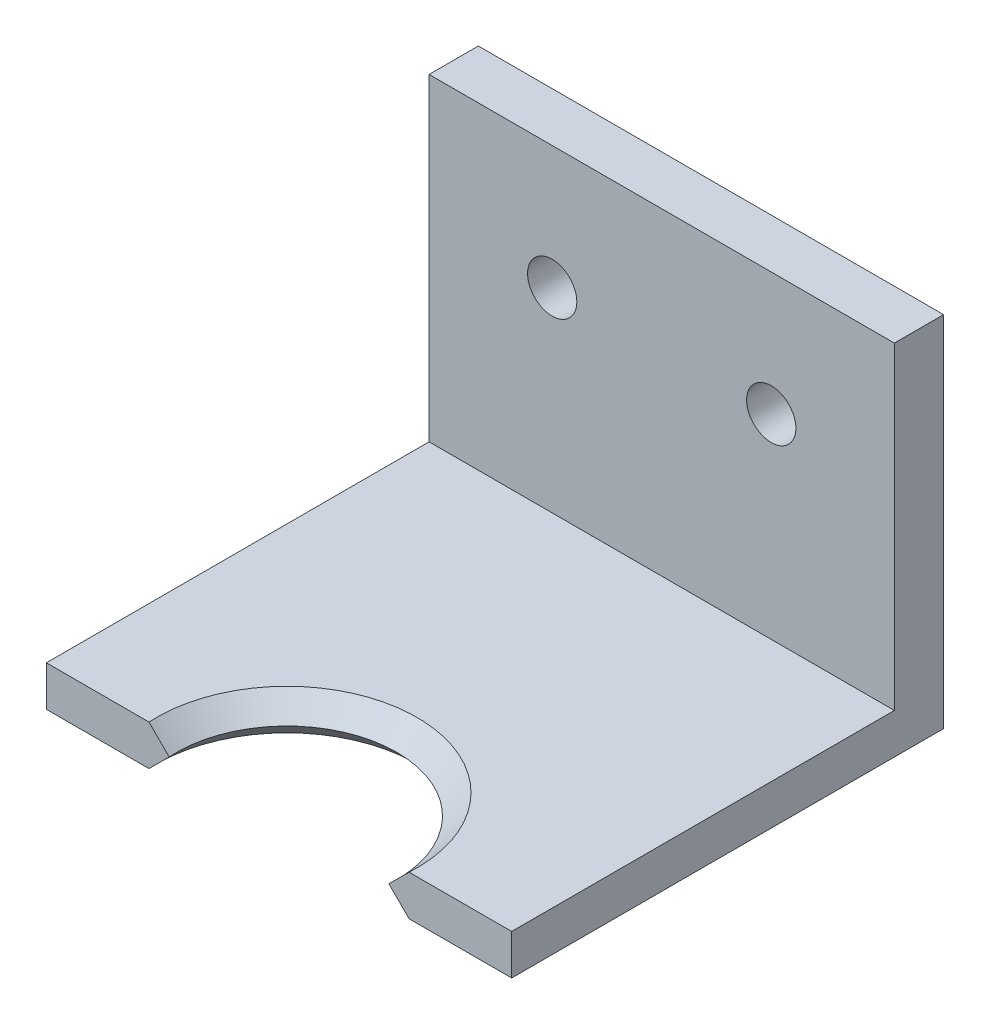
ISO-10303-21;
HEADER;
FILE_DESCRIPTION(('STEP AP214'),'2;1');
FILE_NAME('part.step','',(''),(''),'','','');
FILE_SCHEMA(('AUTOMOTIVE_DESIGN { 1 0 10303 214 1 1 1 1 }'));
ENDSEC;
DATA;
#1=APPLICATION_CONTEXT('core data for automotive mechanical design processes');
#2=APPLICATION_PROTOCOL_DEFINITION('international standard','automotive_design',2000,#1);
#3=PRODUCT_CONTEXT('',#1,'mechanical');
#4=PRODUCT('Part','Part','',(#3));
#5=PRODUCT_RELATED_PRODUCT_CATEGORY('part','',(#4));
#6=PRODUCT_DEFINITION_FORMATION('','',#4);
#7=PRODUCT_DEFINITION_CONTEXT('part definition',#1,'design');
#8=PRODUCT_DEFINITION('design','',#6,#7);
#9=PRODUCT_DEFINITION_SHAPE('','',#8);
#10=(LENGTH_UNIT() NAMED_UNIT(*) SI_UNIT(.MILLI.,.METRE.));
#11=(NAMED_UNIT(*) PLANE_ANGLE_UNIT() SI_UNIT($,.RADIAN.));
#12=(NAMED_UNIT(*) SI_UNIT($,.STERADIAN.) SOLID_ANGLE_UNIT());
#13=UNCERTAINTY_MEASURE_WITH_UNIT(LENGTH_MEASURE(1.E-05),#10,'distance_accuracy_value','');
#14=(GEOMETRIC_REPRESENTATION_CONTEXT(3) GLOBAL_UNCERTAINTY_ASSIGNED_CONTEXT((#13)) GLOBAL_UNIT_ASSIGNED_CONTEXT((#10,
#11,#12)) REPRESENTATION_CONTEXT('',''));
#15=CARTESIAN_POINT('',(0.,0.,0.));
#16=DIRECTION('',(0.,0.,1.));
#17=DIRECTION('',(1.,0.,0.));
#18=AXIS2_PLACEMENT_3D('',#15,#16,#17);
#19=CARTESIAN_POINT('',(30.,-2.6,0.));
#20=DIRECTION('',(0.,0.,-1.));
#21=DIRECTION('',(-1.,0.,0.));
#22=AXIS2_PLACEMENT_3D('',#19,#20,#21);
#23=PLANE('',#22);
#24=DIRECTION('',(-1.,0.,0.));
#25=VECTOR('',#24,1.);
#26=CARTESIAN_POINT('',(30.,-2.6,0.));
#27=LINE('',#26,#25);
#28=CARTESIAN_POINT('',(6.61489415689939,-2.6,0.));
#29=VERTEX_POINT('',#28);
#30=CARTESIAN_POINT('',(0.,-2.6,0.));
#31=VERTEX_POINT('',#30);
#32=EDGE_CURVE('E135',#29,#31,#27,.T.);
#33=ORIENTED_EDGE('',*,*,#32,.F.);
#34=CARTESIAN_POINT('',(6.61489415689939,-2.6,0.));
#35=CARTESIAN_POINT('',(6.83197813496742,-2.38329500472277,0.));
#36=CARTESIAN_POINT('',(7.04908123720135,-2.16660917382159,0.));
#37=CARTESIAN_POINT('',(7.48332569028473,-1.73327584048821,0.));
#38=CARTESIAN_POINT('',(7.70046704113424,-1.51662833805605,0.));
#39=CARTESIAN_POINT('',(7.91762751614969,-1.3,0.));
#40=B_SPLINE_CURVE_WITH_KNOTS('',3,(#34,#35,#36,#37,#38,#39),.UNSPECIFIED.,.F.,.F.,(4,2,4),(0.,
0.920205714401046,1.84041143000467),.UNSPECIFIED.);
#41=CARTESIAN_POINT('',(7.91762751614969,-1.30000000000001,0.));
#42=VERTEX_POINT('',#41);
#43=EDGE_CURVE('E148',#29,#42,#40,.T.);
#44=ORIENTED_EDGE('',*,*,#43,.T.);
#45=CARTESIAN_POINT('',(7.91762751614969,-1.30000000000001,0.));
#46=CARTESIAN_POINT('',(7.70046704113424,-1.08337166194395,0.));
#47=CARTESIAN_POINT('',(7.48332569028473,-0.866724159511791,0.));
#48=CARTESIAN_POINT('',(7.04908123720134,-0.433390826178405,0.));
#49=CARTESIAN_POINT('',(6.83197813496741,-0.216704995277231,0.));
#50=CARTESIAN_POINT('',(6.61489415689938,0.,0.));
#51=B_SPLINE_CURVE_WITH_KNOTS('',3,(#45,#46,#47,#48,#49,#50),.UNSPECIFIED.,.F.,.F.,(4,2,4),(0.,
0.92020571560363,1.84041143000468),.UNSPECIFIED.);
#52=CARTESIAN_POINT('',(6.61489415689938,0.,0.));
#53=VERTEX_POINT('',#52);
#54=EDGE_CURVE('E137',#42,#53,#51,.T.);
#55=ORIENTED_EDGE('',*,*,#54,.T.);
#56=DIRECTION('',(-1.,0.,0.));
#57=VECTOR('',#56,1.);
#58=CARTESIAN_POINT('',(30.,0.,0.));
#59=LINE('',#58,#57);
#60=CARTESIAN_POINT('',(0.,0.,0.));
#61=VERTEX_POINT('',#60);
#62=EDGE_CURVE('E203',#53,#61,#59,.T.);
#63=ORIENTED_EDGE('',*,*,#62,.T.);
#64=DIRECTION('',(0.,-1.,0.));
#65=VECTOR('',#64,1.);
#66=CARTESIAN_POINT('',(0.,-2.6,0.));
#67=LINE('',#66,#65);
#68=EDGE_CURVE('E180',#61,#31,#67,.T.);
#69=ORIENTED_EDGE('',*,*,#68,.T.);
#70=EDGE_LOOP('',(#33,#44,#55,#63,#69));
#71=FACE_BOUND('',#70,.T.);
#72=ADVANCED_FACE('F38',(#71),#23,.F.);
#73=CARTESIAN_POINT('',(23.3851058431006,0.,0.));
#74=CARTESIAN_POINT('',(23.1680218650326,-0.216704995277232,0.));
#75=CARTESIAN_POINT('',(22.9509187627987,-0.433390826178406,0.));
#76=CARTESIAN_POINT('',(22.5166743097153,-0.866724159511792,0.));
#77=CARTESIAN_POINT('',(22.2995329588658,-1.08337166194395,0.));
#78=CARTESIAN_POINT('',(22.0823724838503,-1.30000000000001,0.));
#79=B_SPLINE_CURVE_WITH_KNOTS('',3,(#73,#74,#75,#76,#77,#78),.UNSPECIFIED.,.F.,.F.,(4,2,4),(0.,
0.920205714401049,1.84041143000468),.UNSPECIFIED.);
#80=CARTESIAN_POINT('',(23.3851058431006,0.,0.));
#81=VERTEX_POINT('',#80);
#82=CARTESIAN_POINT('',(22.0823724838503,-1.30000000000001,0.));
#83=VERTEX_POINT('',#82);
#84=EDGE_CURVE('E56',#81,#83,#79,.T.);
#85=ORIENTED_EDGE('',*,*,#84,.T.);
#86=CARTESIAN_POINT('',(22.0823724838503,-1.29999999999999,0.));
#87=CARTESIAN_POINT('',(22.2995329588658,-1.51662833805605,0.));
#88=CARTESIAN_POINT('',(22.5166743097153,-1.73327584048821,0.));
#89=CARTESIAN_POINT('',(22.9509187627987,-2.16660917382159,0.));
#90=CARTESIAN_POINT('',(23.1680218650326,-2.38329500472277,0.));
#91=CARTESIAN_POINT('',(23.3851058431006,-2.6,0.));
#92=B_SPLINE_CURVE_WITH_KNOTS('',3,(#86,#87,#88,#89,#90,#91),.UNSPECIFIED.,.F.,.F.,(4,2,4),(0.,
0.920205715603628,1.84041143000467),.UNSPECIFIED.);
#93=CARTESIAN_POINT('',(23.3851058431006,-2.6,0.));
#94=VERTEX_POINT('',#93);
#95=EDGE_CURVE('E49',#83,#94,#92,.T.);
#96=ORIENTED_EDGE('',*,*,#95,.T.);
#97=CARTESIAN_POINT('',(30.,-2.6,0.));
#98=VERTEX_POINT('',#97);
#99=EDGE_CURVE('E117',#98,#94,#27,.T.);
#100=ORIENTED_EDGE('',*,*,#99,.F.);
#101=DIRECTION('',(0.,-1.,0.));
#102=VECTOR('',#101,1.);
#103=CARTESIAN_POINT('',(30.,-2.6,0.));
#104=LINE('',#103,#102);
#105=CARTESIAN_POINT('',(30.,0.,0.));
#106=VERTEX_POINT('',#105);
#107=EDGE_CURVE('E124',#106,#98,#104,.T.);
#108=ORIENTED_EDGE('',*,*,#107,.F.);
#109=EDGE_CURVE('E214',#106,#81,#59,.T.);
#110=ORIENTED_EDGE('',*,*,#109,.T.);
#111=EDGE_LOOP('',(#85,#96,#100,#108,#110));
#112=FACE_BOUND('',#111,.T.);
#113=ADVANCED_FACE('F132',(#112),#23,.F.);
#114=CARTESIAN_POINT('',(30.,-2.6,-27.85));
#115=DIRECTION('',(0.,1.,0.));
#116=DIRECTION('',(0.,0.,1.));
#117=AXIS2_PLACEMENT_3D('',#114,#115,#116);
#118=PLANE('',#117);
#119=ORIENTED_EDGE('',*,*,#99,.T.);
#120=CARTESIAN_POINT('',(15.,-2.6,-0.5));
#121=DIRECTION('',(0.,1.,0.));
#122=DIRECTION('',(0.,0.,1.));
#123=AXIS2_PLACEMENT_3D('',#120,#121,#122);
#124=CIRCLE('',#123,8.4);
#125=EDGE_CURVE('E134',#94,#29,#124,.T.);
#126=ORIENTED_EDGE('',*,*,#125,.T.);
#127=ORIENTED_EDGE('',*,*,#32,.T.);
#128=DIRECTION('',(0.,0.,-1.));
#129=VECTOR('',#128,1.);
#130=CARTESIAN_POINT('',(0.,-2.6,-27.85));
#131=LINE('',#130,#129);
#132=CARTESIAN_POINT('',(0.,-2.6,-27.85));
#133=VERTEX_POINT('',#132);
#134=EDGE_CURVE('E182',#31,#133,#131,.T.);
#135=ORIENTED_EDGE('',*,*,#134,.T.);
#136=DIRECTION('',(-1.,0.,0.));
#137=VECTOR('',#136,1.);
#138=CARTESIAN_POINT('',(30.,-2.6,-27.85));
#139=LINE('',#138,#137);
#140=CARTESIAN_POINT('',(30.,-2.6,-27.85));
#141=VERTEX_POINT('',#140);
#142=EDGE_CURVE('E120',#141,#133,#139,.T.);
#143=ORIENTED_EDGE('',*,*,#142,.F.);
#144=DIRECTION('',(0.,0.,-1.));
#145=VECTOR('',#144,1.);
#146=CARTESIAN_POINT('',(30.,-2.6,-27.85));
#147=LINE('',#146,#145);
#148=EDGE_CURVE('E112',#98,#141,#147,.T.);
#149=ORIENTED_EDGE('',*,*,#148,.F.);
#150=EDGE_LOOP('',(#119,#126,#127,#135,#143,#149));
#151=FACE_BOUND('',#150,.T.);
#152=ADVANCED_FACE('F114',(#151),#118,.F.);
#153=CARTESIAN_POINT('',(30.,20.5151439999999,-27.85));
#154=DIRECTION('',(0.,0.,1.));
#155=DIRECTION('',(0.,-1.,0.));
#156=AXIS2_PLACEMENT_3D('',#153,#154,#155);
#157=PLANE('',#156);
#158=CARTESIAN_POINT('',(7.9375,12.5776439999999,-27.85));
#159=DIRECTION('',(0.,0.,1.));
#160=DIRECTION('',(1.,0.,0.));
#161=AXIS2_PLACEMENT_3D('',#158,#159,#160);
#162=CIRCLE('',#161,1.5875);
#163=CARTESIAN_POINT('',(9.525,12.5776439999999,-27.85));
#164=VERTEX_POINT('',#163);
#165=EDGE_CURVE('E181',#164,#164,#162,.T.);
#166=ORIENTED_EDGE('',*,*,#165,.T.);
#167=EDGE_LOOP('',(#166));
#168=FACE_BOUND('',#167,.T.);
#169=CARTESIAN_POINT('',(22.0625,12.5776439999999,-27.85));
#170=DIRECTION('',(0.,0.,1.));
#171=DIRECTION('',(1.,0.,0.));
#172=AXIS2_PLACEMENT_3D('',#169,#170,#171);
#173=CIRCLE('',#172,1.5875);
#174=CARTESIAN_POINT('',(23.65,12.5776439999999,-27.85));
#175=VERTEX_POINT('',#174);
#176=EDGE_CURVE('E195',#175,#175,#173,.T.);
#177=ORIENTED_EDGE('',*,*,#176,.T.);
#178=EDGE_LOOP('',(#177));
#179=FACE_BOUND('',#178,.T.);
#180=DIRECTION('',(0.,1.,0.));
#181=VECTOR('',#180,1.);
#182=CARTESIAN_POINT('',(0.,20.5151439999999,-27.85));
#183=LINE('',#182,#181);
#184=CARTESIAN_POINT('',(0.,20.5151439999999,-27.85));
#185=VERTEX_POINT('',#184);
#186=EDGE_CURVE('E206',#133,#185,#183,.T.);
#187=ORIENTED_EDGE('',*,*,#186,.T.);
#188=DIRECTION('',(-1.,0.,0.));
#189=VECTOR('',#188,1.);
#190=CARTESIAN_POINT('',(30.,20.5151439999999,-27.85));
#191=LINE('',#190,#189);
#192=CARTESIAN_POINT('',(30.,20.5151439999999,-27.85));
#193=VERTEX_POINT('',#192);
#194=EDGE_CURVE('E221',#193,#185,#191,.T.);
#195=ORIENTED_EDGE('',*,*,#194,.F.);
#196=DIRECTION('',(0.,1.,0.));
#197=VECTOR('',#196,1.);
#198=CARTESIAN_POINT('',(30.,20.5151439999999,-27.85));
#199=LINE('',#198,#197);
#200=EDGE_CURVE('E123',#141,#193,#199,.T.);
#201=ORIENTED_EDGE('',*,*,#200,.F.);
#202=ORIENTED_EDGE('',*,*,#142,.T.);
#203=EDGE_LOOP('',(#187,#195,#201,#202));
#204=FACE_BOUND('',#203,.T.);
#205=ADVANCED_FACE('F229',(#168,#179,#204),#157,.F.);
#206=CARTESIAN_POINT('',(30.,20.5151439999999,-24.675));
#207=DIRECTION('',(0.,-1.,0.));
#208=DIRECTION('',(0.,0.,-1.));
#209=AXIS2_PLACEMENT_3D('',#206,#207,#208);
#210=PLANE('',#209);
#211=DIRECTION('',(0.,0.,1.));
#212=VECTOR('',#211,1.);
#213=CARTESIAN_POINT('',(0.,20.5151439999999,-24.675));
#214=LINE('',#213,#212);
#215=CARTESIAN_POINT('',(0.,20.5151439999999,-24.675));
#216=VERTEX_POINT('',#215);
#217=EDGE_CURVE('E208',#185,#216,#214,.T.);
#218=ORIENTED_EDGE('',*,*,#217,.T.);
#219=DIRECTION('',(-1.,0.,0.));
#220=VECTOR('',#219,1.);
#221=CARTESIAN_POINT('',(30.,20.5151439999999,-24.675));
#222=LINE('',#221,#220);
#223=CARTESIAN_POINT('',(30.,20.5151439999999,-24.675));
#224=VERTEX_POINT('',#223);
#225=EDGE_CURVE('E219',#224,#216,#222,.T.);
#226=ORIENTED_EDGE('',*,*,#225,.F.);
#227=DIRECTION('',(0.,0.,1.));
#228=VECTOR('',#227,1.);
#229=CARTESIAN_POINT('',(30.,20.5151439999999,-24.675));
#230=LINE('',#229,#228);
#231=EDGE_CURVE('E199',#193,#224,#230,.T.);
#232=ORIENTED_EDGE('',*,*,#231,.F.);
#233=ORIENTED_EDGE('',*,*,#194,.T.);
#234=EDGE_LOOP('',(#218,#226,#232,#233));
#235=FACE_BOUND('',#234,.T.);
#236=ADVANCED_FACE('F237',(#235),#210,.F.);
#237=CARTESIAN_POINT('',(30.,0.,-24.675));
#238=DIRECTION('',(0.,0.,-1.));
#239=DIRECTION('',(0.,1.,0.));
#240=AXIS2_PLACEMENT_3D('',#237,#238,#239);
#241=PLANE('',#240);
#242=CARTESIAN_POINT('',(7.9375,12.5776439999999,-24.675));
#243=DIRECTION('',(0.,0.,1.));
#244=DIRECTION('',(1.,0.,0.));
#245=AXIS2_PLACEMENT_3D('',#242,#243,#244);
#246=CIRCLE('',#245,1.5875);
#247=CARTESIAN_POINT('',(9.525,12.5776439999999,-24.675));
#248=VERTEX_POINT('',#247);
#249=EDGE_CURVE('E185',#248,#248,#246,.T.);
#250=ORIENTED_EDGE('',*,*,#249,.F.);
#251=EDGE_LOOP('',(#250));
#252=FACE_BOUND('',#251,.T.);
#253=CARTESIAN_POINT('',(22.0625,12.5776439999999,-24.675));
#254=DIRECTION('',(0.,0.,1.));
#255=DIRECTION('',(1.,0.,0.));
#256=AXIS2_PLACEMENT_3D('',#253,#254,#255);
#257=CIRCLE('',#256,1.5875);
#258=CARTESIAN_POINT('',(23.65,12.5776439999999,-24.675));
#259=VERTEX_POINT('',#258);
#260=EDGE_CURVE('E190',#259,#259,#257,.T.);
#261=ORIENTED_EDGE('',*,*,#260,.F.);
#262=EDGE_LOOP('',(#261));
#263=FACE_BOUND('',#262,.T.);
#264=DIRECTION('',(0.,-1.,0.));
#265=VECTOR('',#264,1.);
#266=CARTESIAN_POINT('',(0.,0.,-24.675));
#267=LINE('',#266,#265);
#268=CARTESIAN_POINT('',(0.,0.,-24.675));
#269=VERTEX_POINT('',#268);
#270=EDGE_CURVE('E210',#216,#269,#267,.T.);
#271=ORIENTED_EDGE('',*,*,#270,.T.);
#272=DIRECTION('',(-1.,0.,0.));
#273=VECTOR('',#272,1.);
#274=CARTESIAN_POINT('',(30.,0.,-24.675));
#275=LINE('',#274,#273);
#276=CARTESIAN_POINT('',(30.,0.,-24.675));
#277=VERTEX_POINT('',#276);
#278=EDGE_CURVE('E216',#277,#269,#275,.T.);
#279=ORIENTED_EDGE('',*,*,#278,.F.);
#280=DIRECTION('',(0.,-1.,0.));
#281=VECTOR('',#280,1.);
#282=CARTESIAN_POINT('',(30.,0.,-24.675));
#283=LINE('',#282,#281);
#284=EDGE_CURVE('E201',#224,#277,#283,.T.);
#285=ORIENTED_EDGE('',*,*,#284,.F.);
#286=ORIENTED_EDGE('',*,*,#225,.T.);
#287=EDGE_LOOP('',(#271,#279,#285,#286));
#288=FACE_BOUND('',#287,.T.);
#289=ADVANCED_FACE('F240',(#252,#263,#288),#241,.F.);
#290=CARTESIAN_POINT('',(30.,0.,0.));
#291=DIRECTION('',(0.,-1.,0.));
#292=DIRECTION('',(0.,0.,-1.));
#293=AXIS2_PLACEMENT_3D('',#290,#291,#292);
#294=PLANE('',#293);
#295=ORIENTED_EDGE('',*,*,#62,.F.);
#296=CARTESIAN_POINT('',(15.,0.,-0.5));
#297=DIRECTION('',(0.,-1.,0.));
#298=DIRECTION('',(0.,0.,-1.));
#299=AXIS2_PLACEMENT_3D('',#296,#297,#298);
#300=CIRCLE('',#299,8.40000000000001);
#301=EDGE_CURVE('E11',#53,#81,#300,.T.);
#302=ORIENTED_EDGE('',*,*,#301,.T.);
#303=ORIENTED_EDGE('',*,*,#109,.F.);
#304=DIRECTION('',(0.,0.,1.));
#305=VECTOR('',#304,1.);
#306=CARTESIAN_POINT('',(30.,0.,0.));
#307=LINE('',#306,#305);
#308=EDGE_CURVE('E129',#277,#106,#307,.T.);
#309=ORIENTED_EDGE('',*,*,#308,.F.);
#310=ORIENTED_EDGE('',*,*,#278,.T.);
#311=DIRECTION('',(0.,0.,1.));
#312=VECTOR('',#311,1.);
#313=CARTESIAN_POINT('',(0.,0.,0.));
#314=LINE('',#313,#312);
#315=EDGE_CURVE('E130',#269,#61,#314,.T.);
#316=ORIENTED_EDGE('',*,*,#315,.T.);
#317=EDGE_LOOP('',(#295,#302,#303,#309,#310,#316));
#318=FACE_BOUND('',#317,.T.);
#319=ADVANCED_FACE('F242',(#318),#294,.F.);
#320=CARTESIAN_POINT('',(30.,0.,0.));
#321=DIRECTION('',(-1.,0.,0.));
#322=DIRECTION('',(0.,0.,1.));
#323=AXIS2_PLACEMENT_3D('',#320,#321,#322);
#324=PLANE('',#323);
#325=ORIENTED_EDGE('',*,*,#107,.T.);
#326=ORIENTED_EDGE('',*,*,#148,.T.);
#327=ORIENTED_EDGE('',*,*,#200,.T.);
#328=ORIENTED_EDGE('',*,*,#231,.T.);
#329=ORIENTED_EDGE('',*,*,#284,.T.);
#330=ORIENTED_EDGE('',*,*,#308,.T.);
#331=EDGE_LOOP('',(#325,#326,#327,#328,#329,#330));
#332=FACE_BOUND('',#331,.T.);
#333=ADVANCED_FACE('F127',(#332),#324,.F.);
#334=CARTESIAN_POINT('',(0.,0.,0.));
#335=DIRECTION('',(-1.,0.,0.));
#336=DIRECTION('',(0.,0.,1.));
#337=AXIS2_PLACEMENT_3D('',#334,#335,#336);
#338=PLANE('',#337);
#339=ORIENTED_EDGE('',*,*,#68,.F.);
#340=ORIENTED_EDGE('',*,*,#315,.F.);
#341=ORIENTED_EDGE('',*,*,#270,.F.);
#342=ORIENTED_EDGE('',*,*,#217,.F.);
#343=ORIENTED_EDGE('',*,*,#186,.F.);
#344=ORIENTED_EDGE('',*,*,#134,.F.);
#345=EDGE_LOOP('',(#339,#340,#341,#342,#343,#344));
#346=FACE_BOUND('',#345,.T.);
#347=ADVANCED_FACE('F233',(#346),#338,.T.);
#348=CARTESIAN_POINT('',(15.,-1.30000000000001,-0.5));
#349=DIRECTION('',(0.,1.,0.));
#350=DIRECTION('',(0.,0.,1.));
#351=AXIS2_PLACEMENT_3D('',#348,#349,#350);
#352=CONICAL_SURFACE('',#351,7.1,0.78539816339745);
#353=CARTESIAN_POINT('',(15.,-1.30000000000001,-0.5));
#354=DIRECTION('',(0.,-1.,0.));
#355=DIRECTION('',(0.,0.,-1.));
#356=AXIS2_PLACEMENT_3D('',#353,#354,#355);
#357=CIRCLE('',#356,7.1);
#358=EDGE_CURVE('E44',#83,#42,#357,.F.);
#359=ORIENTED_EDGE('',*,*,#358,.F.);
#360=ORIENTED_EDGE('',*,*,#84,.F.);
#361=ORIENTED_EDGE('',*,*,#301,.F.);
#362=ORIENTED_EDGE('',*,*,#54,.F.);
#363=EDGE_LOOP('',(#359,#360,#361,#362));
#364=FACE_BOUND('',#363,.T.);
#365=ADVANCED_FACE('F41',(#364),#352,.F.);
#366=CARTESIAN_POINT('',(15.,-2.6,-0.5));
#367=DIRECTION('',(0.,-1.,0.));
#368=DIRECTION('',(0.,0.,-1.));
#369=AXIS2_PLACEMENT_3D('',#366,#367,#368);
#370=CONICAL_SURFACE('',#369,8.4,0.785398163397448);
#371=ORIENTED_EDGE('',*,*,#95,.F.);
#372=ORIENTED_EDGE('',*,*,#358,.T.);
#373=ORIENTED_EDGE('',*,*,#43,.F.);
#374=ORIENTED_EDGE('',*,*,#125,.F.);
#375=EDGE_LOOP('',(#371,#372,#373,#374));
#376=FACE_BOUND('',#375,.T.);
#377=ADVANCED_FACE('F159',(#376),#370,.F.);
#378=CARTESIAN_POINT('',(22.0625,12.5776439999999,-27.85));
#379=DIRECTION('',(0.,0.,1.));
#380=DIRECTION('',(1.,0.,0.));
#381=AXIS2_PLACEMENT_3D('',#378,#379,#380);
#382=CYLINDRICAL_SURFACE('',#381,1.5875);
#383=CARTESIAN_POINT('',(23.65,12.5776439999999,-27.85));
#384=CARTESIAN_POINT('',(23.65,12.5776439999999,-27.8169270833333));
#385=CARTESIAN_POINT('',(23.65,12.5776439999999,-27.7838541666667));
#386=CARTESIAN_POINT('',(23.65,12.5776439999999,-27.7177083333333));
#387=CARTESIAN_POINT('',(23.65,12.5776439999999,-27.6846354166667));
#388=CARTESIAN_POINT('',(23.65,12.5776439999999,-27.6184895833333));
#389=CARTESIAN_POINT('',(23.65,12.5776439999999,-27.5854166666667));
#390=CARTESIAN_POINT('',(23.65,12.5776439999999,-27.5192708333333));
#391=CARTESIAN_POINT('',(23.65,12.5776439999999,-27.4861979166667));
#392=CARTESIAN_POINT('',(23.65,12.5776439999999,-27.4200520833333));
#393=CARTESIAN_POINT('',(23.65,12.5776439999999,-27.3869791666667));
#394=CARTESIAN_POINT('',(23.65,12.5776439999999,-27.3208333333333));
#395=CARTESIAN_POINT('',(23.65,12.5776439999999,-27.2877604166667));
#396=CARTESIAN_POINT('',(23.65,12.5776439999999,-27.2216145833333));
#397=CARTESIAN_POINT('',(23.65,12.5776439999999,-27.1885416666667));
#398=CARTESIAN_POINT('',(23.65,12.5776439999999,-27.1223958333333));
#399=CARTESIAN_POINT('',(23.65,12.5776439999999,-27.0893229166667));
#400=CARTESIAN_POINT('',(23.65,12.5776439999999,-27.0231770833333));
#401=CARTESIAN_POINT('',(23.65,12.5776439999999,-26.9901041666667));
#402=CARTESIAN_POINT('',(23.65,12.5776439999999,-26.9239583333333));
#403=CARTESIAN_POINT('',(23.65,12.5776439999999,-26.8908854166667));
#404=CARTESIAN_POINT('',(23.65,12.5776439999999,-26.8247395833333));
#405=CARTESIAN_POINT('',(23.65,12.5776439999999,-26.7916666666667));
#406=CARTESIAN_POINT('',(23.65,12.5776439999999,-26.7255208333333));
#407=CARTESIAN_POINT('',(23.65,12.5776439999999,-26.6924479166667));
#408=CARTESIAN_POINT('',(23.65,12.5776439999999,-26.6263020833333));
#409=CARTESIAN_POINT('',(23.65,12.5776439999999,-26.5932291666667));
#410=CARTESIAN_POINT('',(23.65,12.5776439999999,-26.5270833333333));
#411=CARTESIAN_POINT('',(23.65,12.5776439999999,-26.4940104166667));
#412=CARTESIAN_POINT('',(23.65,12.5776439999999,-26.4278645833333));
#413=CARTESIAN_POINT('',(23.65,12.5776439999999,-26.3947916666667));
#414=CARTESIAN_POINT('',(23.65,12.5776439999999,-26.3286458333333));
#415=CARTESIAN_POINT('',(23.65,12.5776439999999,-26.2955729166667));
#416=CARTESIAN_POINT('',(23.65,12.5776439999999,-26.2294270833333));
#417=CARTESIAN_POINT('',(23.65,12.5776439999999,-26.1963541666667));
#418=CARTESIAN_POINT('',(23.65,12.5776439999999,-26.1302083333333));
#419=CARTESIAN_POINT('',(23.65,12.5776439999999,-26.0971354166667));
#420=CARTESIAN_POINT('',(23.65,12.5776439999999,-26.0309895833333));
#421=CARTESIAN_POINT('',(23.65,12.5776439999999,-25.9979166666667));
#422=CARTESIAN_POINT('',(23.65,12.5776439999999,-25.9317708333333));
#423=CARTESIAN_POINT('',(23.65,12.5776439999999,-25.8986979166667));
#424=CARTESIAN_POINT('',(23.65,12.5776439999999,-25.8325520833333));
#425=CARTESIAN_POINT('',(23.65,12.5776439999999,-25.7994791666667));
#426=CARTESIAN_POINT('',(23.65,12.5776439999999,-25.7333333333333));
#427=CARTESIAN_POINT('',(23.65,12.5776439999999,-25.7002604166667));
#428=CARTESIAN_POINT('',(23.65,12.5776439999999,-25.6341145833333));
#429=CARTESIAN_POINT('',(23.65,12.5776439999999,-25.6010416666667));
#430=CARTESIAN_POINT('',(23.65,12.5776439999999,-25.5348958333333));
#431=CARTESIAN_POINT('',(23.65,12.5776439999999,-25.5018229166667));
#432=CARTESIAN_POINT('',(23.65,12.5776439999999,-25.4356770833333));
#433=CARTESIAN_POINT('',(23.65,12.5776439999999,-25.4026041666667));
#434=CARTESIAN_POINT('',(23.65,12.5776439999999,-25.3364583333333));
#435=CARTESIAN_POINT('',(23.65,12.5776439999999,-25.3033854166667));
#436=CARTESIAN_POINT('',(23.65,12.5776439999999,-25.2372395833333));
#437=CARTESIAN_POINT('',(23.65,12.5776439999999,-25.2041666666667));
#438=CARTESIAN_POINT('',(23.65,12.5776439999999,-25.1380208333333));
#439=CARTESIAN_POINT('',(23.65,12.5776439999999,-25.1049479166667));
#440=CARTESIAN_POINT('',(23.65,12.5776439999999,-25.0388020833333));
#441=CARTESIAN_POINT('',(23.65,12.5776439999999,-25.0057291666667));
#442=CARTESIAN_POINT('',(23.65,12.5776439999999,-24.9395833333333));
#443=CARTESIAN_POINT('',(23.65,12.5776439999999,-24.9065104166667));
#444=CARTESIAN_POINT('',(23.65,12.5776439999999,-24.8403645833333));
#445=CARTESIAN_POINT('',(23.65,12.5776439999999,-24.8072916666667));
#446=CARTESIAN_POINT('',(23.65,12.5776439999999,-24.7411458333333));
#447=CARTESIAN_POINT('',(23.65,12.5776439999999,-24.7080729166667));
#448=CARTESIAN_POINT('',(23.65,12.5776439999999,-24.675));
#449=B_SPLINE_CURVE_WITH_KNOTS('',3,(#383,#384,#385,#386,#387,#388,#389,#390,#391,#392,#393,
#394,#395,#396,#397,#398,#399,#400,#401,#402,#403,#404,#405,#406,#407,#408,#409,#410,#411,#412,
#413,#414,#415,#416,#417,#418,#419,#420,#421,#422,#423,#424,#425,#426,#427,#428,#429,#430,#431,
#432,#433,#434,#435,#436,#437,#438,#439,#440,#441,#442,#443,#444,#445,#446,#447,#448),
.UNSPECIFIED.,.F.,.F.,(4,2,2,2,2,2,2,2,2,2,2,2,2,2,2,2,2,2,2,2,2,2,2,2,2,2,2,2,2,2,2,2,4),(0.,
0.0992187500000012,0.198437500000002,0.297656250000004,0.396875000000001,0.496093750000003,
0.595312500000004,0.694531250000005,0.793750000000003,0.892968750000004,0.992187500000005,
1.09140625,1.190625,1.28984375000001,1.38906250000001,1.48828125,1.58750000000001,
1.68671875000001,1.7859375,1.88515625000001,1.98437500000001,2.08359375000001,2.18281250000001,
2.28203125000001,2.38125000000001,2.48046875000001,2.57968750000001,2.67890625000001,
2.77812500000001,2.87734375000001,2.97656250000001,3.07578125000001,3.17500000000001),.UNSPECIFIED.);
#450=EDGE_CURVE('BSEAM290',#175,#259,#449,.T.);
#451=ORIENTED_EDGE('',*,*,#176,.F.);
#452=ORIENTED_EDGE('',*,*,#260,.T.);
#453=ORIENTED_EDGE('',*,*,#450,.T.);
#454=ORIENTED_EDGE('',*,*,#450,.F.);
#455=EDGE_LOOP('',(#451,#453,#452,#454));
#456=FACE_BOUND('',#455,.T.);
#457=ADVANCED_FACE('F290',(#456),#382,.F.);
#458=CARTESIAN_POINT('',(7.9375,12.5776439999999,-27.85));
#459=DIRECTION('',(0.,0.,1.));
#460=DIRECTION('',(1.,0.,0.));
#461=AXIS2_PLACEMENT_3D('',#458,#459,#460);
#462=CYLINDRICAL_SURFACE('',#461,1.5875);
#463=CARTESIAN_POINT('',(9.525,12.5776439999999,-27.85));
#464=CARTESIAN_POINT('',(9.525,12.5776439999999,-27.8169270833333));
#465=CARTESIAN_POINT('',(9.525,12.5776439999999,-27.7838541666667));
#466=CARTESIAN_POINT('',(9.525,12.5776439999999,-27.7177083333333));
#467=CARTESIAN_POINT('',(9.525,12.5776439999999,-27.6846354166667));
#468=CARTESIAN_POINT('',(9.525,12.5776439999999,-27.6184895833333));
#469=CARTESIAN_POINT('',(9.525,12.5776439999999,-27.5854166666667));
#470=CARTESIAN_POINT('',(9.525,12.5776439999999,-27.5192708333333));
#471=CARTESIAN_POINT('',(9.525,12.5776439999999,-27.4861979166667));
#472=CARTESIAN_POINT('',(9.525,12.5776439999999,-27.4200520833333));
#473=CARTESIAN_POINT('',(9.525,12.5776439999999,-27.3869791666667));
#474=CARTESIAN_POINT('',(9.525,12.5776439999999,-27.3208333333333));
#475=CARTESIAN_POINT('',(9.525,12.5776439999999,-27.2877604166667));
#476=CARTESIAN_POINT('',(9.525,12.5776439999999,-27.2216145833333));
#477=CARTESIAN_POINT('',(9.525,12.5776439999999,-27.1885416666667));
#478=CARTESIAN_POINT('',(9.525,12.5776439999999,-27.1223958333333));
#479=CARTESIAN_POINT('',(9.525,12.5776439999999,-27.0893229166667));
#480=CARTESIAN_POINT('',(9.525,12.5776439999999,-27.0231770833333));
#481=CARTESIAN_POINT('',(9.525,12.5776439999999,-26.9901041666667));
#482=CARTESIAN_POINT('',(9.525,12.5776439999999,-26.9239583333333));
#483=CARTESIAN_POINT('',(9.525,12.5776439999999,-26.8908854166667));
#484=CARTESIAN_POINT('',(9.525,12.5776439999999,-26.8247395833333));
#485=CARTESIAN_POINT('',(9.525,12.5776439999999,-26.7916666666667));
#486=CARTESIAN_POINT('',(9.525,12.5776439999999,-26.7255208333333));
#487=CARTESIAN_POINT('',(9.525,12.5776439999999,-26.6924479166667));
#488=CARTESIAN_POINT('',(9.525,12.5776439999999,-26.6263020833333));
#489=CARTESIAN_POINT('',(9.525,12.5776439999999,-26.5932291666667));
#490=CARTESIAN_POINT('',(9.525,12.5776439999999,-26.5270833333333));
#491=CARTESIAN_POINT('',(9.525,12.5776439999999,-26.4940104166667));
#492=CARTESIAN_POINT('',(9.525,12.5776439999999,-26.4278645833333));
#493=CARTESIAN_POINT('',(9.525,12.5776439999999,-26.3947916666667));
#494=CARTESIAN_POINT('',(9.525,12.5776439999999,-26.3286458333333));
#495=CARTESIAN_POINT('',(9.525,12.5776439999999,-26.2955729166667));
#496=CARTESIAN_POINT('',(9.525,12.5776439999999,-26.2294270833333));
#497=CARTESIAN_POINT('',(9.525,12.5776439999999,-26.1963541666667));
#498=CARTESIAN_POINT('',(9.525,12.5776439999999,-26.1302083333333));
#499=CARTESIAN_POINT('',(9.525,12.5776439999999,-26.0971354166667));
#500=CARTESIAN_POINT('',(9.525,12.5776439999999,-26.0309895833333));
#501=CARTESIAN_POINT('',(9.525,12.5776439999999,-25.9979166666667));
#502=CARTESIAN_POINT('',(9.525,12.5776439999999,-25.9317708333333));
#503=CARTESIAN_POINT('',(9.525,12.5776439999999,-25.8986979166667));
#504=CARTESIAN_POINT('',(9.525,12.5776439999999,-25.8325520833333));
#505=CARTESIAN_POINT('',(9.525,12.5776439999999,-25.7994791666667));
#506=CARTESIAN_POINT('',(9.525,12.5776439999999,-25.7333333333333));
#507=CARTESIAN_POINT('',(9.525,12.5776439999999,-25.7002604166667));
#508=CARTESIAN_POINT('',(9.525,12.5776439999999,-25.6341145833333));
#509=CARTESIAN_POINT('',(9.525,12.5776439999999,-25.6010416666667));
#510=CARTESIAN_POINT('',(9.525,12.5776439999999,-25.5348958333333));
#511=CARTESIAN_POINT('',(9.525,12.5776439999999,-25.5018229166667));
#512=CARTESIAN_POINT('',(9.525,12.5776439999999,-25.4356770833333));
#513=CARTESIAN_POINT('',(9.525,12.5776439999999,-25.4026041666667));
#514=CARTESIAN_POINT('',(9.525,12.5776439999999,-25.3364583333333));
#515=CARTESIAN_POINT('',(9.525,12.5776439999999,-25.3033854166667));
#516=CARTESIAN_POINT('',(9.525,12.5776439999999,-25.2372395833333));
#517=CARTESIAN_POINT('',(9.525,12.5776439999999,-25.2041666666667));
#518=CARTESIAN_POINT('',(9.525,12.5776439999999,-25.1380208333333));
#519=CARTESIAN_POINT('',(9.525,12.5776439999999,-25.1049479166667));
#520=CARTESIAN_POINT('',(9.525,12.5776439999999,-25.0388020833333));
#521=CARTESIAN_POINT('',(9.525,12.5776439999999,-25.0057291666667));
#522=CARTESIAN_POINT('',(9.525,12.5776439999999,-24.9395833333333));
#523=CARTESIAN_POINT('',(9.525,12.5776439999999,-24.9065104166667));
#524=CARTESIAN_POINT('',(9.525,12.5776439999999,-24.8403645833333));
#525=CARTESIAN_POINT('',(9.525,12.5776439999999,-24.8072916666667));
#526=CARTESIAN_POINT('',(9.525,12.5776439999999,-24.7411458333333));
#527=CARTESIAN_POINT('',(9.525,12.5776439999999,-24.7080729166667));
#528=CARTESIAN_POINT('',(9.525,12.5776439999999,-24.675));
#529=B_SPLINE_CURVE_WITH_KNOTS('',3,(#463,#464,#465,#466,#467,#468,#469,#470,#471,#472,#473,
#474,#475,#476,#477,#478,#479,#480,#481,#482,#483,#484,#485,#486,#487,#488,#489,#490,#491,#492,
#493,#494,#495,#496,#497,#498,#499,#500,#501,#502,#503,#504,#505,#506,#507,#508,#509,#510,#511,
#512,#513,#514,#515,#516,#517,#518,#519,#520,#521,#522,#523,#524,#525,#526,#527,#528),
.UNSPECIFIED.,.F.,.F.,(4,2,2,2,2,2,2,2,2,2,2,2,2,2,2,2,2,2,2,2,2,2,2,2,2,2,2,2,2,2,2,2,4),(0.,
0.0992187500000012,0.198437500000002,0.297656250000004,0.396875000000001,0.496093750000003,
0.595312500000004,0.694531250000005,0.793750000000003,0.892968750000004,0.992187500000005,
1.09140625,1.190625,1.28984375000001,1.38906250000001,1.48828125,1.58750000000001,
1.68671875000001,1.7859375,1.88515625000001,1.98437500000001,2.08359375000001,2.18281250000001,
2.28203125000001,2.38125000000001,2.48046875000001,2.57968750000001,2.67890625000001,
2.77812500000001,2.87734375000001,2.97656250000001,3.07578125000001,3.17500000000001),.UNSPECIFIED.);
#530=EDGE_CURVE('BSEAM295',#164,#248,#529,.T.);
#531=ORIENTED_EDGE('',*,*,#165,.F.);
#532=ORIENTED_EDGE('',*,*,#249,.T.);
#533=ORIENTED_EDGE('',*,*,#530,.T.);
#534=ORIENTED_EDGE('',*,*,#530,.F.);
#535=EDGE_LOOP('',(#531,#533,#532,#534));
#536=FACE_BOUND('',#535,.T.);
#537=ADVANCED_FACE('F295',(#536),#462,.F.);
#538=CLOSED_SHELL('',(#72,#113,#152,#205,#236,#289,#319,#333,#347,#365,#377,#457,#537));
#539=MANIFOLD_SOLID_BREP('B2',#538);
#540=ADVANCED_BREP_SHAPE_REPRESENTATION('',(#18,#539),#14);
#541=SHAPE_DEFINITION_REPRESENTATION(#9,#540);
ENDSEC;
END-ISO-10303-21;
